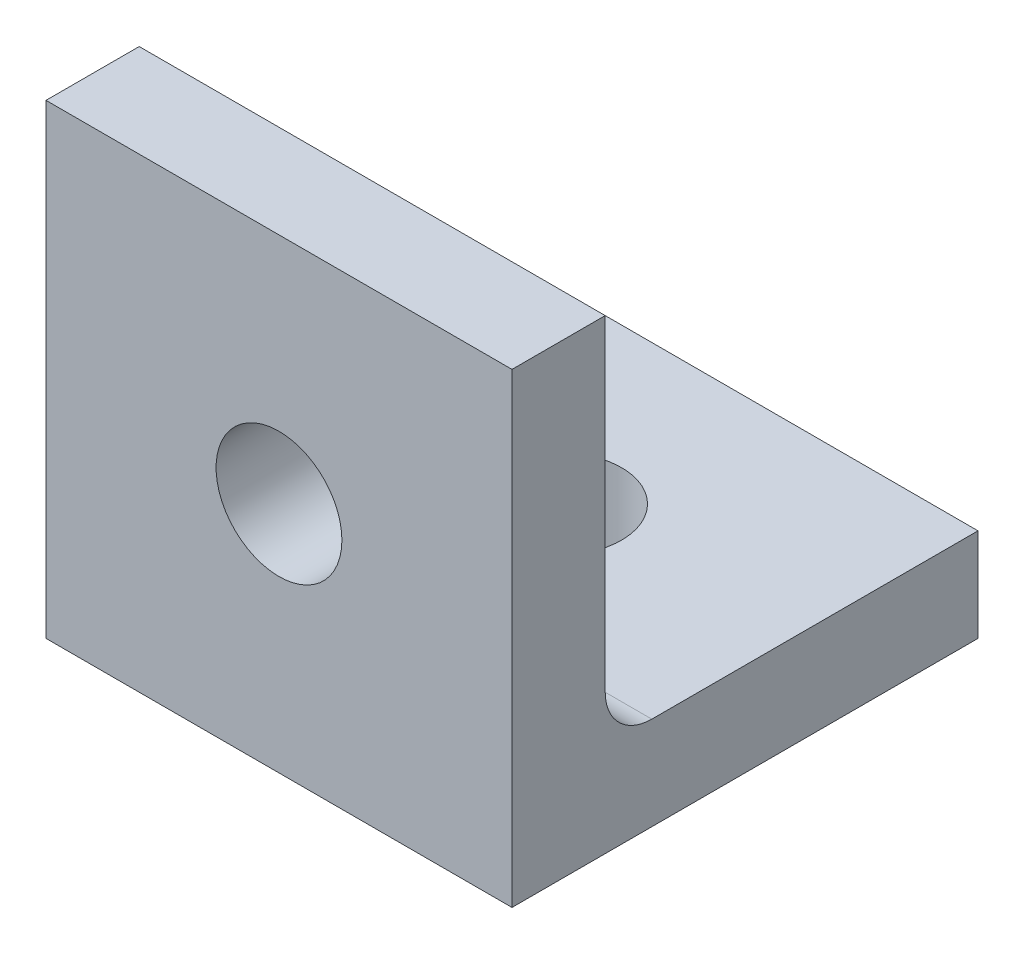
ISO-10303-21;
HEADER;
FILE_DESCRIPTION(('STEP AP214'),'2;1');
FILE_NAME('part.step','',(''),(''),'','','');
FILE_SCHEMA(('AUTOMOTIVE_DESIGN { 1 0 10303 214 1 1 1 1 }'));
ENDSEC;
DATA;
#1=APPLICATION_CONTEXT('core data for automotive mechanical design processes');
#2=APPLICATION_PROTOCOL_DEFINITION('international standard','automotive_design',2000,#1);
#3=PRODUCT_CONTEXT('',#1,'mechanical');
#4=PRODUCT('Part','Part','',(#3));
#5=PRODUCT_RELATED_PRODUCT_CATEGORY('part','',(#4));
#6=PRODUCT_DEFINITION_FORMATION('','',#4);
#7=PRODUCT_DEFINITION_CONTEXT('part definition',#1,'design');
#8=PRODUCT_DEFINITION('design','',#6,#7);
#9=PRODUCT_DEFINITION_SHAPE('','',#8);
#10=(LENGTH_UNIT() NAMED_UNIT(*) SI_UNIT(.MILLI.,.METRE.));
#11=(NAMED_UNIT(*) PLANE_ANGLE_UNIT() SI_UNIT($,.RADIAN.));
#12=(NAMED_UNIT(*) SI_UNIT($,.STERADIAN.) SOLID_ANGLE_UNIT());
#13=UNCERTAINTY_MEASURE_WITH_UNIT(LENGTH_MEASURE(1.E-05),#10,'distance_accuracy_value','');
#14=(GEOMETRIC_REPRESENTATION_CONTEXT(3) GLOBAL_UNCERTAINTY_ASSIGNED_CONTEXT((#13)) GLOBAL_UNIT_ASSIGNED_CONTEXT((#10,
#11,#12)) REPRESENTATION_CONTEXT('',''));
#15=CARTESIAN_POINT('',(0.,0.,0.));
#16=DIRECTION('',(0.,0.,1.));
#17=DIRECTION('',(1.,0.,0.));
#18=AXIS2_PLACEMENT_3D('',#15,#16,#17);
#19=CARTESIAN_POINT('',(0.,0.,2.54));
#20=DIRECTION('',(0.,0.,1.));
#21=DIRECTION('',(1.,0.,0.));
#22=AXIS2_PLACEMENT_3D('',#19,#20,#21);
#23=PLANE('',#22);
#24=DIRECTION('',(0.,-1.,0.));
#25=VECTOR('',#24,1.);
#26=CARTESIAN_POINT('',(0.,0.,2.54));
#27=LINE('',#26,#25);
#28=CARTESIAN_POINT('',(0.,0.,2.54));
#29=VERTEX_POINT('',#28);
#30=CARTESIAN_POINT('',(0.,-25.4,2.54));
#31=VERTEX_POINT('',#30);
#32=EDGE_CURVE('E150',#29,#31,#27,.T.);
#33=ORIENTED_EDGE('',*,*,#32,.T.);
#34=DIRECTION('',(1.,0.,0.));
#35=VECTOR('',#34,1.);
#36=CARTESIAN_POINT('',(0.,-25.4,2.54));
#37=LINE('',#36,#35);
#38=CARTESIAN_POINT('',(25.4,-25.4,2.54));
#39=VERTEX_POINT('',#38);
#40=EDGE_CURVE('E102',#31,#39,#37,.T.);
#41=ORIENTED_EDGE('',*,*,#40,.T.);
#42=DIRECTION('',(0.,1.,0.));
#43=VECTOR('',#42,1.);
#44=CARTESIAN_POINT('',(25.4,0.,2.54));
#45=LINE('',#44,#43);
#46=CARTESIAN_POINT('',(25.4,0.,2.54));
#47=VERTEX_POINT('',#46);
#48=EDGE_CURVE('E156',#39,#47,#45,.T.);
#49=ORIENTED_EDGE('',*,*,#48,.T.);
#50=DIRECTION('',(-1.,0.,0.));
#51=VECTOR('',#50,1.);
#52=CARTESIAN_POINT('',(0.,0.,2.54));
#53=LINE('',#52,#51);
#54=EDGE_CURVE('E159',#47,#29,#53,.T.);
#55=ORIENTED_EDGE('',*,*,#54,.T.);
#56=EDGE_LOOP('',(#33,#41,#49,#55));
#57=FACE_BOUND('',#56,.T.);
#58=CARTESIAN_POINT('',(12.7,-12.7,2.54));
#59=DIRECTION('',(0.,0.,1.));
#60=DIRECTION('',(1.,0.,0.));
#61=AXIS2_PLACEMENT_3D('',#58,#59,#60);
#62=CIRCLE('',#61,3.429);
#63=CARTESIAN_POINT('',(16.129,-12.7,2.54));
#64=VERTEX_POINT('',#63);
#65=EDGE_CURVE('E142',#64,#64,#62,.T.);
#66=ORIENTED_EDGE('',*,*,#65,.F.);
#67=EDGE_LOOP('',(#66));
#68=FACE_BOUND('',#67,.T.);
#69=ADVANCED_FACE('F38',(#57,#68),#23,.T.);
#70=CARTESIAN_POINT('',(0.,0.,-2.54));
#71=DIRECTION('',(0.,0.,1.));
#72=DIRECTION('',(1.,0.,0.));
#73=AXIS2_PLACEMENT_3D('',#70,#71,#72);
#74=PLANE('',#73);
#75=DIRECTION('',(0.,1.,0.));
#76=VECTOR('',#75,1.);
#77=CARTESIAN_POINT('',(25.4,0.,-2.54));
#78=LINE('',#77,#76);
#79=CARTESIAN_POINT('',(25.4,-17.78,-2.54));
#80=VERTEX_POINT('',#79);
#81=CARTESIAN_POINT('',(25.4,0.,-2.54));
#82=VERTEX_POINT('',#81);
#83=EDGE_CURVE('E165',#80,#82,#78,.T.);
#84=ORIENTED_EDGE('',*,*,#83,.F.);
#85=DIRECTION('',(-1.,0.,0.));
#86=VECTOR('',#85,1.);
#87=CARTESIAN_POINT('',(0.,-17.78,-2.54));
#88=LINE('',#87,#86);
#89=CARTESIAN_POINT('',(0.,-17.78,-2.54));
#90=VERTEX_POINT('',#89);
#91=EDGE_CURVE('E106',#80,#90,#88,.T.);
#92=ORIENTED_EDGE('',*,*,#91,.T.);
#93=DIRECTION('',(0.,-1.,0.));
#94=VECTOR('',#93,1.);
#95=CARTESIAN_POINT('',(0.,0.,-2.54));
#96=LINE('',#95,#94);
#97=CARTESIAN_POINT('',(0.,0.,-2.54));
#98=VERTEX_POINT('',#97);
#99=EDGE_CURVE('E146',#98,#90,#96,.T.);
#100=ORIENTED_EDGE('',*,*,#99,.F.);
#101=DIRECTION('',(-1.,0.,0.));
#102=VECTOR('',#101,1.);
#103=CARTESIAN_POINT('',(0.,0.,-2.54));
#104=LINE('',#103,#102);
#105=EDGE_CURVE('E153',#82,#98,#104,.T.);
#106=ORIENTED_EDGE('',*,*,#105,.F.);
#107=EDGE_LOOP('',(#84,#92,#100,#106));
#108=FACE_BOUND('',#107,.T.);
#109=CARTESIAN_POINT('',(12.7,-12.7,-2.54));
#110=DIRECTION('',(0.,0.,1.));
#111=DIRECTION('',(1.,0.,0.));
#112=AXIS2_PLACEMENT_3D('',#109,#110,#111);
#113=CIRCLE('',#112,3.429);
#114=CARTESIAN_POINT('',(16.129,-12.7,-2.54));
#115=VERTEX_POINT('',#114);
#116=EDGE_CURVE('E139',#115,#115,#113,.T.);
#117=ORIENTED_EDGE('',*,*,#116,.T.);
#118=EDGE_LOOP('',(#117));
#119=FACE_BOUND('',#118,.T.);
#120=ADVANCED_FACE('F188',(#108,#119),#74,.F.);
#121=CARTESIAN_POINT('',(0.,0.,2.54));
#122=DIRECTION('',(1.,0.,0.));
#123=DIRECTION('',(0.,0.,-1.));
#124=AXIS2_PLACEMENT_3D('',#121,#122,#123);
#125=PLANE('',#124);
#126=ORIENTED_EDGE('',*,*,#99,.T.);
#127=CARTESIAN_POINT('',(0.,-17.78,-5.08));
#128=DIRECTION('',(1.,0.,0.));
#129=DIRECTION('',(0.,0.,-1.));
#130=AXIS2_PLACEMENT_3D('',#127,#128,#129);
#131=CIRCLE('',#130,2.54);
#132=CARTESIAN_POINT('',(0.,-20.32,-5.08));
#133=VERTEX_POINT('',#132);
#134=EDGE_CURVE('E47',#90,#133,#131,.T.);
#135=ORIENTED_EDGE('',*,*,#134,.T.);
#136=DIRECTION('',(0.,0.,1.));
#137=VECTOR('',#136,1.);
#138=CARTESIAN_POINT('',(0.,-20.32,-22.86));
#139=LINE('',#138,#137);
#140=CARTESIAN_POINT('',(0.,-20.32,-22.86));
#141=VERTEX_POINT('',#140);
#142=EDGE_CURVE('E121',#141,#133,#139,.T.);
#143=ORIENTED_EDGE('',*,*,#142,.F.);
#144=DIRECTION('',(0.,-1.,0.));
#145=VECTOR('',#144,1.);
#146=CARTESIAN_POINT('',(0.,-25.4,-22.86));
#147=LINE('',#146,#145);
#148=CARTESIAN_POINT('',(0.,-25.4,-22.86));
#149=VERTEX_POINT('',#148);
#150=EDGE_CURVE('E114',#141,#149,#147,.T.);
#151=ORIENTED_EDGE('',*,*,#150,.T.);
#152=DIRECTION('',(0.,0.,-1.));
#153=VECTOR('',#152,1.);
#154=CARTESIAN_POINT('',(0.,-25.4,2.54));
#155=LINE('',#154,#153);
#156=EDGE_CURVE('E97',#31,#149,#155,.T.);
#157=ORIENTED_EDGE('',*,*,#156,.F.);
#158=ORIENTED_EDGE('',*,*,#32,.F.);
#159=DIRECTION('',(0.,0.,-1.));
#160=VECTOR('',#159,1.);
#161=CARTESIAN_POINT('',(0.,0.,2.54));
#162=LINE('',#161,#160);
#163=EDGE_CURVE('E162',#29,#98,#162,.T.);
#164=ORIENTED_EDGE('',*,*,#163,.T.);
#165=EDGE_LOOP('',(#126,#135,#143,#151,#157,#158,#164));
#166=FACE_BOUND('',#165,.T.);
#167=ADVANCED_FACE('F120',(#166),#125,.F.);
#168=CARTESIAN_POINT('',(0.,-25.4,2.54));
#169=DIRECTION('',(0.,1.,0.));
#170=DIRECTION('',(0.,0.,1.));
#171=AXIS2_PLACEMENT_3D('',#168,#169,#170);
#172=PLANE('',#171);
#173=CARTESIAN_POINT('',(12.7,-25.4,-12.7));
#174=DIRECTION('',(0.,1.,0.));
#175=DIRECTION('',(0.,0.,1.));
#176=AXIS2_PLACEMENT_3D('',#173,#174,#175);
#177=CIRCLE('',#176,3.429);
#178=CARTESIAN_POINT('',(12.7,-25.4,-9.271));
#179=VERTEX_POINT('',#178);
#180=EDGE_CURVE('E123',#179,#179,#177,.F.);
#181=ORIENTED_EDGE('',*,*,#180,.F.);
#182=EDGE_LOOP('',(#181));
#183=FACE_BOUND('',#182,.T.);
#184=ORIENTED_EDGE('',*,*,#156,.T.);
#185=DIRECTION('',(1.,0.,0.));
#186=VECTOR('',#185,1.);
#187=CARTESIAN_POINT('',(0.,-25.4,-22.86));
#188=LINE('',#187,#186);
#189=CARTESIAN_POINT('',(25.4,-25.4,-22.86));
#190=VERTEX_POINT('',#189);
#191=EDGE_CURVE('E101',#149,#190,#188,.T.);
#192=ORIENTED_EDGE('',*,*,#191,.T.);
#193=DIRECTION('',(0.,0.,-1.));
#194=VECTOR('',#193,1.);
#195=CARTESIAN_POINT('',(25.4,-25.4,2.54));
#196=LINE('',#195,#194);
#197=EDGE_CURVE('E107',#39,#190,#196,.T.);
#198=ORIENTED_EDGE('',*,*,#197,.F.);
#199=ORIENTED_EDGE('',*,*,#40,.F.);
#200=EDGE_LOOP('',(#184,#192,#198,#199));
#201=FACE_BOUND('',#200,.T.);
#202=ADVANCED_FACE('F99',(#183,#201),#172,.F.);
#203=CARTESIAN_POINT('',(25.4,0.,2.54));
#204=DIRECTION('',(-1.,0.,0.));
#205=DIRECTION('',(0.,-1.,0.));
#206=AXIS2_PLACEMENT_3D('',#203,#204,#205);
#207=PLANE('',#206);
#208=DIRECTION('',(0.,0.,-1.));
#209=VECTOR('',#208,1.);
#210=CARTESIAN_POINT('',(25.4,0.,2.54));
#211=LINE('',#210,#209);
#212=EDGE_CURVE('E173',#47,#82,#211,.T.);
#213=ORIENTED_EDGE('',*,*,#212,.F.);
#214=ORIENTED_EDGE('',*,*,#48,.F.);
#215=ORIENTED_EDGE('',*,*,#197,.T.);
#216=DIRECTION('',(0.,1.,0.));
#217=VECTOR('',#216,1.);
#218=CARTESIAN_POINT('',(25.4,-25.4,-22.86));
#219=LINE('',#218,#217);
#220=CARTESIAN_POINT('',(25.4,-20.32,-22.86));
#221=VERTEX_POINT('',#220);
#222=EDGE_CURVE('E117',#190,#221,#219,.T.);
#223=ORIENTED_EDGE('',*,*,#222,.T.);
#224=DIRECTION('',(0.,0.,1.));
#225=VECTOR('',#224,1.);
#226=CARTESIAN_POINT('',(25.4,-20.32,-22.86));
#227=LINE('',#226,#225);
#228=CARTESIAN_POINT('',(25.4,-20.32,-5.08));
#229=VERTEX_POINT('',#228);
#230=EDGE_CURVE('E136',#221,#229,#227,.T.);
#231=ORIENTED_EDGE('',*,*,#230,.T.);
#232=CARTESIAN_POINT('',(25.4,-17.78,-5.08));
#233=DIRECTION('',(-1.,0.,0.));
#234=DIRECTION('',(0.,-1.,0.));
#235=AXIS2_PLACEMENT_3D('',#232,#233,#234);
#236=CIRCLE('',#235,2.54);
#237=EDGE_CURVE('E11',#229,#80,#236,.T.);
#238=ORIENTED_EDGE('',*,*,#237,.T.);
#239=ORIENTED_EDGE('',*,*,#83,.T.);
#240=EDGE_LOOP('',(#213,#214,#215,#223,#231,#238,#239));
#241=FACE_BOUND('',#240,.T.);
#242=ADVANCED_FACE('F200',(#241),#207,.F.);
#243=CARTESIAN_POINT('',(0.,0.,2.54));
#244=DIRECTION('',(0.,-1.,0.));
#245=DIRECTION('',(0.,0.,-1.));
#246=AXIS2_PLACEMENT_3D('',#243,#244,#245);
#247=PLANE('',#246);
#248=ORIENTED_EDGE('',*,*,#105,.T.);
#249=ORIENTED_EDGE('',*,*,#163,.F.);
#250=ORIENTED_EDGE('',*,*,#54,.F.);
#251=ORIENTED_EDGE('',*,*,#212,.T.);
#252=EDGE_LOOP('',(#248,#249,#250,#251));
#253=FACE_BOUND('',#252,.T.);
#254=ADVANCED_FACE('F196',(#253),#247,.F.);
#255=CARTESIAN_POINT('',(12.7,-12.7,2.54));
#256=DIRECTION('',(0.,0.,-1.));
#257=DIRECTION('',(-1.,0.,0.));
#258=AXIS2_PLACEMENT_3D('',#255,#256,#257);
#259=CYLINDRICAL_SURFACE('',#258,3.429);
#260=ORIENTED_EDGE('',*,*,#65,.T.);
#261=EDGE_LOOP('',(#260));
#262=FACE_BOUND('',#261,.T.);
#263=ORIENTED_EDGE('',*,*,#116,.F.);
#264=EDGE_LOOP('',(#263));
#265=FACE_BOUND('',#264,.T.);
#266=ADVANCED_FACE('F218',(#262,#265),#259,.F.);
#267=CARTESIAN_POINT('',(0.,-20.32,-22.86));
#268=DIRECTION('',(0.,1.,0.));
#269=DIRECTION('',(0.,0.,1.));
#270=AXIS2_PLACEMENT_3D('',#267,#268,#269);
#271=PLANE('',#270);
#272=CARTESIAN_POINT('',(12.7,-20.32,-12.7));
#273=DIRECTION('',(0.,1.,0.));
#274=DIRECTION('',(0.,0.,1.));
#275=AXIS2_PLACEMENT_3D('',#272,#273,#274);
#276=CIRCLE('',#275,3.429);
#277=CARTESIAN_POINT('',(12.7,-20.32,-9.271));
#278=VERTEX_POINT('',#277);
#279=EDGE_CURVE('E127',#278,#278,#276,.T.);
#280=ORIENTED_EDGE('',*,*,#279,.F.);
#281=EDGE_LOOP('',(#280));
#282=FACE_BOUND('',#281,.T.);
#283=ORIENTED_EDGE('',*,*,#142,.T.);
#284=DIRECTION('',(-1.,0.,0.));
#285=VECTOR('',#284,1.);
#286=CARTESIAN_POINT('',(0.,-20.32,-5.08));
#287=LINE('',#286,#285);
#288=EDGE_CURVE('E60',#133,#229,#287,.F.);
#289=ORIENTED_EDGE('',*,*,#288,.T.);
#290=ORIENTED_EDGE('',*,*,#230,.F.);
#291=DIRECTION('',(-1.,0.,0.));
#292=VECTOR('',#291,1.);
#293=CARTESIAN_POINT('',(0.,-20.32,-22.86));
#294=LINE('',#293,#292);
#295=EDGE_CURVE('E133',#221,#141,#294,.T.);
#296=ORIENTED_EDGE('',*,*,#295,.T.);
#297=EDGE_LOOP('',(#283,#289,#290,#296));
#298=FACE_BOUND('',#297,.T.);
#299=ADVANCED_FACE('F239',(#282,#298),#271,.T.);
#300=CARTESIAN_POINT('',(0.,0.,-22.86));
#301=DIRECTION('',(0.,0.,-1.));
#302=DIRECTION('',(-1.,0.,0.));
#303=AXIS2_PLACEMENT_3D('',#300,#301,#302);
#304=PLANE('',#303);
#305=ORIENTED_EDGE('',*,*,#150,.F.);
#306=ORIENTED_EDGE('',*,*,#295,.F.);
#307=ORIENTED_EDGE('',*,*,#222,.F.);
#308=ORIENTED_EDGE('',*,*,#191,.F.);
#309=EDGE_LOOP('',(#305,#306,#307,#308));
#310=FACE_BOUND('',#309,.T.);
#311=ADVANCED_FACE('F112',(#310),#304,.T.);
#312=CARTESIAN_POINT('',(12.7,-35.0986766107547,-12.7));
#313=DIRECTION('',(0.,1.,0.));
#314=DIRECTION('',(0.,0.,1.));
#315=AXIS2_PLACEMENT_3D('',#312,#313,#314);
#316=CYLINDRICAL_SURFACE('',#315,3.429);
#317=ORIENTED_EDGE('',*,*,#180,.T.);
#318=EDGE_LOOP('',(#317));
#319=FACE_BOUND('',#318,.T.);
#320=ORIENTED_EDGE('',*,*,#279,.T.);
#321=EDGE_LOOP('',(#320));
#322=FACE_BOUND('',#321,.T.);
#323=ADVANCED_FACE('F202',(#319,#322),#316,.F.);
#324=CARTESIAN_POINT('',(0.,-17.78,-5.08));
#325=DIRECTION('',(-1.,0.,0.));
#326=DIRECTION('',(0.,0.,1.));
#327=AXIS2_PLACEMENT_3D('',#324,#325,#326);
#328=CYLINDRICAL_SURFACE('',#327,2.54);
#329=ORIENTED_EDGE('',*,*,#237,.F.);
#330=ORIENTED_EDGE('',*,*,#288,.F.);
#331=ORIENTED_EDGE('',*,*,#134,.F.);
#332=ORIENTED_EDGE('',*,*,#91,.F.);
#333=EDGE_LOOP('',(#329,#330,#331,#332));
#334=FACE_BOUND('',#333,.T.);
#335=ADVANCED_FACE('F40',(#334),#328,.F.);
#336=CLOSED_SHELL('',(#69,#120,#167,#202,#242,#254,#266,#299,#311,#323,#335));
#337=MANIFOLD_SOLID_BREP('B2',#336);
#338=ADVANCED_BREP_SHAPE_REPRESENTATION('',(#18,#337),#14);
#339=SHAPE_DEFINITION_REPRESENTATION(#9,#338);
ENDSEC;
END-ISO-10303-21;
